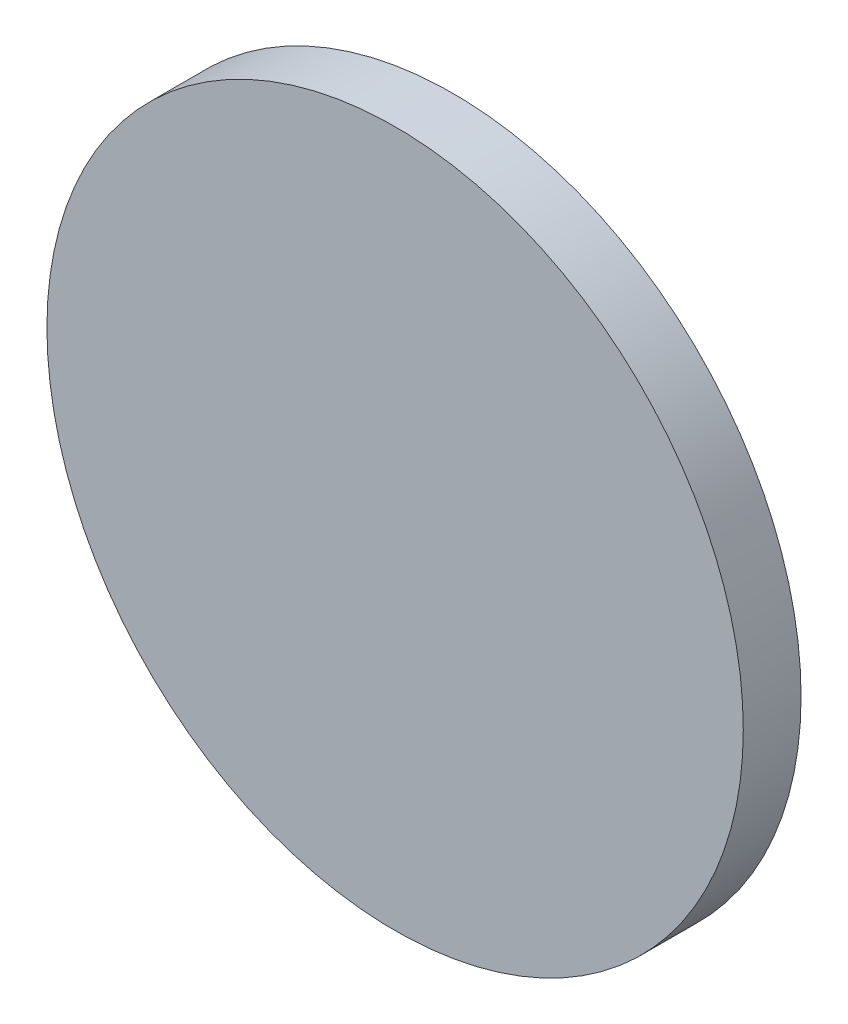
ISO-10303-21;
HEADER;
FILE_DESCRIPTION(('STEP AP214'),'2;1');
FILE_NAME('part.step','',(''),(''),'','','');
FILE_SCHEMA(('AUTOMOTIVE_DESIGN { 1 0 10303 214 1 1 1 1 }'));
ENDSEC;
DATA;
#1=APPLICATION_CONTEXT('core data for automotive mechanical design processes');
#2=APPLICATION_PROTOCOL_DEFINITION('international standard','automotive_design',2000,#1);
#3=PRODUCT_CONTEXT('',#1,'mechanical');
#4=PRODUCT('Part','Part','',(#3));
#5=PRODUCT_RELATED_PRODUCT_CATEGORY('part','',(#4));
#6=PRODUCT_DEFINITION_FORMATION('','',#4);
#7=PRODUCT_DEFINITION_CONTEXT('part definition',#1,'design');
#8=PRODUCT_DEFINITION('design','',#6,#7);
#9=PRODUCT_DEFINITION_SHAPE('','',#8);
#10=(LENGTH_UNIT() NAMED_UNIT(*) SI_UNIT(.MILLI.,.METRE.));
#11=(NAMED_UNIT(*) PLANE_ANGLE_UNIT() SI_UNIT($,.RADIAN.));
#12=(NAMED_UNIT(*) SI_UNIT($,.STERADIAN.) SOLID_ANGLE_UNIT());
#13=UNCERTAINTY_MEASURE_WITH_UNIT(LENGTH_MEASURE(1.E-05),#10,'distance_accuracy_value','');
#14=(GEOMETRIC_REPRESENTATION_CONTEXT(3) GLOBAL_UNCERTAINTY_ASSIGNED_CONTEXT((#13)) GLOBAL_UNIT_ASSIGNED_CONTEXT((#10,
#11,#12)) REPRESENTATION_CONTEXT('',''));
#15=CARTESIAN_POINT('',(0.,0.,0.));
#16=DIRECTION('',(0.,0.,1.));
#17=DIRECTION('',(1.,0.,0.));
#18=AXIS2_PLACEMENT_3D('',#15,#16,#17);
#19=CARTESIAN_POINT('',(-58.1454388525344,33.8589899223507,50.));
#20=DIRECTION('',(0.,0.,-1.));
#21=DIRECTION('',(-1.,0.,0.));
#22=AXIS2_PLACEMENT_3D('',#19,#20,#21);
#23=CYLINDRICAL_SURFACE('',#22,301.204332140222);
#24=CARTESIAN_POINT('',(-58.1454388525344,33.8589899223507,50.));
#25=DIRECTION('',(0.,0.,1.));
#26=DIRECTION('',(1.,0.,0.));
#27=AXIS2_PLACEMENT_3D('',#24,#25,#26);
#28=CIRCLE('',#27,301.204332140222);
#29=CARTESIAN_POINT('',(243.058893287688,33.8589899223507,50.));
#30=VERTEX_POINT('',#29);
#31=EDGE_CURVE('E10',#30,#30,#28,.T.);
#32=ORIENTED_EDGE('',*,*,#31,.F.);
#33=EDGE_LOOP('',(#32));
#34=FACE_BOUND('',#33,.T.);
#35=CARTESIAN_POINT('',(-58.1454388525344,33.8589899223507,0.));
#36=DIRECTION('',(0.,0.,1.));
#37=DIRECTION('',(1.,0.,0.));
#38=AXIS2_PLACEMENT_3D('',#35,#36,#37);
#39=CIRCLE('',#38,301.204332140222);
#40=CARTESIAN_POINT('',(243.058893287688,33.8589899223507,0.));
#41=VERTEX_POINT('',#40);
#42=EDGE_CURVE('E36',#41,#41,#39,.T.);
#43=ORIENTED_EDGE('',*,*,#42,.T.);
#44=EDGE_LOOP('',(#43));
#45=FACE_BOUND('',#44,.T.);
#46=ADVANCED_FACE('F33',(#34,#45),#23,.T.);
#47=CARTESIAN_POINT('',(-58.1454388525344,33.8589899223507,50.));
#48=DIRECTION('',(0.,0.,1.));
#49=DIRECTION('',(1.,0.,0.));
#50=AXIS2_PLACEMENT_3D('',#47,#48,#49);
#51=PLANE('',#50);
#52=ORIENTED_EDGE('',*,*,#31,.T.);
#53=EDGE_LOOP('',(#52));
#54=FACE_BOUND('',#53,.T.);
#55=ADVANCED_FACE('F48',(#54),#51,.T.);
#56=CARTESIAN_POINT('',(-58.1454388525344,33.8589899223507,0.));
#57=DIRECTION('',(0.,0.,1.));
#58=DIRECTION('',(1.,0.,0.));
#59=AXIS2_PLACEMENT_3D('',#56,#57,#58);
#60=PLANE('',#59);
#61=ORIENTED_EDGE('',*,*,#42,.F.);
#62=EDGE_LOOP('',(#61));
#63=FACE_BOUND('',#62,.T.);
#64=ADVANCED_FACE('F46',(#63),#60,.F.);
#65=CLOSED_SHELL('',(#46,#55,#64));
#66=MANIFOLD_SOLID_BREP('B2',#65);
#67=ADVANCED_BREP_SHAPE_REPRESENTATION('',(#18,#66),#14);
#68=SHAPE_DEFINITION_REPRESENTATION(#9,#67);
ENDSEC;
END-ISO-10303-21;
